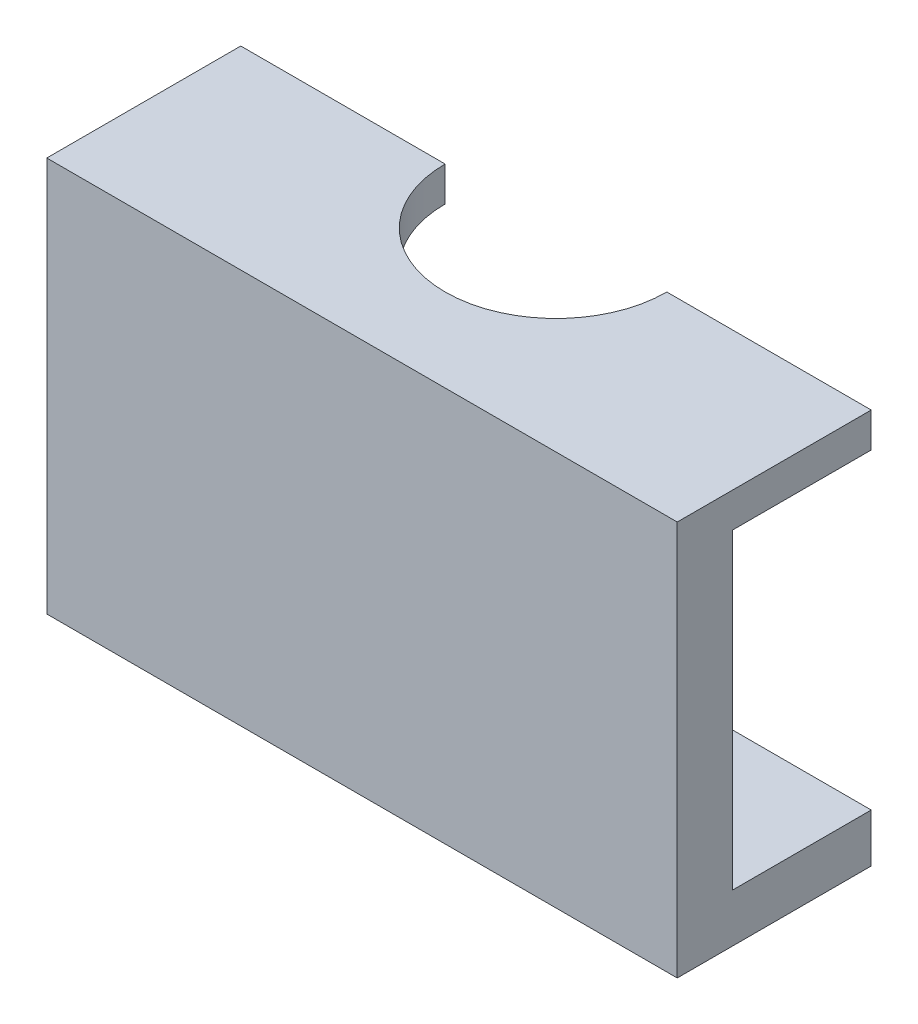
ISO-10303-21;
HEADER;
FILE_DESCRIPTION(('STEP AP214'),'2;1');
FILE_NAME('part.step','',(''),(''),'','','');
FILE_SCHEMA(('AUTOMOTIVE_DESIGN { 1 0 10303 214 1 1 1 1 }'));
ENDSEC;
DATA;
#1=APPLICATION_CONTEXT('core data for automotive mechanical design processes');
#2=APPLICATION_PROTOCOL_DEFINITION('international standard','automotive_design',2000,#1);
#3=PRODUCT_CONTEXT('',#1,'mechanical');
#4=PRODUCT('Part','Part','',(#3));
#5=PRODUCT_RELATED_PRODUCT_CATEGORY('part','',(#4));
#6=PRODUCT_DEFINITION_FORMATION('','',#4);
#7=PRODUCT_DEFINITION_CONTEXT('part definition',#1,'design');
#8=PRODUCT_DEFINITION('design','',#6,#7);
#9=PRODUCT_DEFINITION_SHAPE('','',#8);
#10=(LENGTH_UNIT() NAMED_UNIT(*) SI_UNIT(.MILLI.,.METRE.));
#11=(NAMED_UNIT(*) PLANE_ANGLE_UNIT() SI_UNIT($,.RADIAN.));
#12=(NAMED_UNIT(*) SI_UNIT($,.STERADIAN.) SOLID_ANGLE_UNIT());
#13=UNCERTAINTY_MEASURE_WITH_UNIT(LENGTH_MEASURE(1.E-05),#10,'distance_accuracy_value','');
#14=(GEOMETRIC_REPRESENTATION_CONTEXT(3) GLOBAL_UNCERTAINTY_ASSIGNED_CONTEXT((#13)) GLOBAL_UNIT_ASSIGNED_CONTEXT((#10,
#11,#12)) REPRESENTATION_CONTEXT('',''));
#15=CARTESIAN_POINT('',(0.,0.,0.));
#16=DIRECTION('',(0.,0.,1.));
#17=DIRECTION('',(1.,0.,0.));
#18=AXIS2_PLACEMENT_3D('',#15,#16,#17);
#19=CARTESIAN_POINT('',(0.,0.,0.));
#20=DIRECTION('',(0.,0.,-1.));
#21=DIRECTION('',(-1.,0.,0.));
#22=AXIS2_PLACEMENT_3D('',#19,#20,#21);
#23=PLANE('',#22);
#24=DIRECTION('',(1.,0.,0.));
#25=VECTOR('',#24,1.);
#26=CARTESIAN_POINT('',(0.,3.5,0.));
#27=LINE('',#26,#25);
#28=CARTESIAN_POINT('',(0.,3.5,0.));
#29=VERTEX_POINT('',#28);
#30=CARTESIAN_POINT('',(11.65,3.5,0.));
#31=VERTEX_POINT('',#30);
#32=EDGE_CURVE('E274',#29,#31,#27,.T.);
#33=ORIENTED_EDGE('',*,*,#32,.T.);
#34=DIRECTION('',(0.,-1.,0.));
#35=VECTOR('',#34,1.);
#36=CARTESIAN_POINT('',(11.65,59.8955410846827,0.));
#37=LINE('',#36,#35);
#38=CARTESIAN_POINT('',(11.65,0.,0.));
#39=VERTEX_POINT('',#38);
#40=EDGE_CURVE('E149',#39,#31,#37,.F.);
#41=ORIENTED_EDGE('',*,*,#40,.F.);
#42=DIRECTION('',(1.,0.,0.));
#43=VECTOR('',#42,1.);
#44=CARTESIAN_POINT('',(0.,0.,0.));
#45=LINE('',#44,#43);
#46=CARTESIAN_POINT('',(0.,0.,0.));
#47=VERTEX_POINT('',#46);
#48=EDGE_CURVE('E173',#47,#39,#45,.T.);
#49=ORIENTED_EDGE('',*,*,#48,.F.);
#50=DIRECTION('',(0.,-1.,0.));
#51=VECTOR('',#50,1.);
#52=CARTESIAN_POINT('',(0.,0.,0.));
#53=LINE('',#52,#51);
#54=EDGE_CURVE('E169',#29,#47,#53,.T.);
#55=ORIENTED_EDGE('',*,*,#54,.F.);
#56=EDGE_LOOP('',(#33,#41,#49,#55));
#57=FACE_BOUND('',#56,.T.);
#58=ADVANCED_FACE('F41',(#57),#23,.T.);
#59=CARTESIAN_POINT('',(33.85,3.5,0.));
#60=VERTEX_POINT('',#59);
#61=CARTESIAN_POINT('',(45.5,3.5,0.));
#62=VERTEX_POINT('',#61);
#63=EDGE_CURVE('E234',#60,#62,#27,.T.);
#64=ORIENTED_EDGE('',*,*,#63,.T.);
#65=DIRECTION('',(0.,1.,0.));
#66=VECTOR('',#65,1.);
#67=CARTESIAN_POINT('',(45.5,0.,0.));
#68=LINE('',#67,#66);
#69=CARTESIAN_POINT('',(45.5,0.,0.));
#70=VERTEX_POINT('',#69);
#71=EDGE_CURVE('E183',#70,#62,#68,.T.);
#72=ORIENTED_EDGE('',*,*,#71,.F.);
#73=CARTESIAN_POINT('',(33.85,0.,0.));
#74=VERTEX_POINT('',#73);
#75=EDGE_CURVE('E168',#74,#70,#45,.T.);
#76=ORIENTED_EDGE('',*,*,#75,.F.);
#77=DIRECTION('',(0.,-1.,0.));
#78=VECTOR('',#77,1.);
#79=CARTESIAN_POINT('',(33.85,59.8955410846827,0.));
#80=LINE('',#79,#78);
#81=EDGE_CURVE('E215',#60,#74,#80,.T.);
#82=ORIENTED_EDGE('',*,*,#81,.F.);
#83=EDGE_LOOP('',(#64,#72,#76,#82));
#84=FACE_BOUND('',#83,.T.);
#85=ADVANCED_FACE('F232',(#84),#23,.T.);
#86=CARTESIAN_POINT('',(22.75,-1.5,0.));
#87=DIRECTION('',(0.,1.,0.));
#88=DIRECTION('',(0.,0.,1.));
#89=AXIS2_PLACEMENT_3D('',#86,#87,#88);
#90=CYLINDRICAL_SURFACE('',#89,8.);
#91=CARTESIAN_POINT('',(22.75,26.,0.));
#92=DIRECTION('',(0.,-1.,0.));
#93=DIRECTION('',(0.,0.,-1.));
#94=AXIS2_PLACEMENT_3D('',#91,#92,#93);
#95=CIRCLE('',#94,8.);
#96=CARTESIAN_POINT('',(14.75,26.,0.));
#97=VERTEX_POINT('',#96);
#98=CARTESIAN_POINT('',(30.75,26.,0.));
#99=VERTEX_POINT('',#98);
#100=EDGE_CURVE('E213',#97,#99,#95,.F.);
#101=ORIENTED_EDGE('',*,*,#100,.F.);
#102=DIRECTION('',(0.,1.,0.));
#103=VECTOR('',#102,1.);
#104=CARTESIAN_POINT('',(14.75,-1.5,0.));
#105=LINE('',#104,#103);
#106=CARTESIAN_POINT('',(14.75,28.5,0.));
#107=VERTEX_POINT('',#106);
#108=EDGE_CURVE('E147',#97,#107,#105,.T.);
#109=ORIENTED_EDGE('',*,*,#108,.T.);
#110=CARTESIAN_POINT('',(22.75,28.5,0.));
#111=DIRECTION('',(0.,1.,0.));
#112=DIRECTION('',(0.,0.,1.));
#113=AXIS2_PLACEMENT_3D('',#110,#111,#112);
#114=CIRCLE('',#113,8.);
#115=CARTESIAN_POINT('',(30.75,28.5,0.));
#116=VERTEX_POINT('',#115);
#117=EDGE_CURVE('E175',#107,#116,#114,.T.);
#118=ORIENTED_EDGE('',*,*,#117,.T.);
#119=DIRECTION('',(0.,1.,0.));
#120=VECTOR('',#119,1.);
#121=CARTESIAN_POINT('',(30.75,-1.5,0.));
#122=LINE('',#121,#120);
#123=EDGE_CURVE('E207',#116,#99,#122,.F.);
#124=ORIENTED_EDGE('',*,*,#123,.T.);
#125=EDGE_LOOP('',(#101,#109,#118,#124));
#126=FACE_BOUND('',#125,.T.);
#127=ADVANCED_FACE('F323',(#126),#90,.F.);
#128=DIRECTION('',(-1.,0.,0.));
#129=VECTOR('',#128,1.);
#130=CARTESIAN_POINT('',(0.,26.,0.));
#131=LINE('',#130,#129);
#132=CARTESIAN_POINT('',(0.,26.,0.));
#133=VERTEX_POINT('',#132);
#134=EDGE_CURVE('E64',#97,#133,#131,.T.);
#135=ORIENTED_EDGE('',*,*,#134,.T.);
#136=CARTESIAN_POINT('',(0.,28.5,0.));
#137=VERTEX_POINT('',#136);
#138=EDGE_CURVE('E146',#137,#133,#53,.T.);
#139=ORIENTED_EDGE('',*,*,#138,.F.);
#140=DIRECTION('',(-1.,0.,0.));
#141=VECTOR('',#140,1.);
#142=CARTESIAN_POINT('',(0.,28.5,0.));
#143=LINE('',#142,#141);
#144=EDGE_CURVE('E187',#107,#137,#143,.T.);
#145=ORIENTED_EDGE('',*,*,#144,.F.);
#146=ORIENTED_EDGE('',*,*,#108,.F.);
#147=EDGE_LOOP('',(#135,#139,#145,#146));
#148=FACE_BOUND('',#147,.T.);
#149=ADVANCED_FACE('F143',(#148),#23,.T.);
#150=CARTESIAN_POINT('',(0.,0.,14.));
#151=DIRECTION('',(1.,0.,0.));
#152=DIRECTION('',(0.,0.,-1.));
#153=AXIS2_PLACEMENT_3D('',#150,#151,#152);
#154=PLANE('',#153);
#155=DIRECTION('',(0.,-1.,0.));
#156=VECTOR('',#155,1.);
#157=CARTESIAN_POINT('',(0.,26.,9.99725954309286));
#158=LINE('',#157,#156);
#159=CARTESIAN_POINT('',(0.,26.,9.99725954309286));
#160=VERTEX_POINT('',#159);
#161=CARTESIAN_POINT('',(0.,3.5,9.99725954309285));
#162=VERTEX_POINT('',#161);
#163=EDGE_CURVE('E160',#160,#162,#158,.T.);
#164=ORIENTED_EDGE('',*,*,#163,.T.);
#165=DIRECTION('',(0.,0.,-1.));
#166=VECTOR('',#165,1.);
#167=CARTESIAN_POINT('',(0.,3.5,0.));
#168=LINE('',#167,#166);
#169=EDGE_CURVE('E294',#162,#29,#168,.T.);
#170=ORIENTED_EDGE('',*,*,#169,.T.);
#171=ORIENTED_EDGE('',*,*,#54,.T.);
#172=DIRECTION('',(0.,0.,-1.));
#173=VECTOR('',#172,1.);
#174=CARTESIAN_POINT('',(0.,0.,14.));
#175=LINE('',#174,#173);
#176=CARTESIAN_POINT('',(0.,0.,14.));
#177=VERTEX_POINT('',#176);
#178=EDGE_CURVE('E203',#177,#47,#175,.T.);
#179=ORIENTED_EDGE('',*,*,#178,.F.);
#180=DIRECTION('',(0.,-1.,0.));
#181=VECTOR('',#180,1.);
#182=CARTESIAN_POINT('',(0.,0.,14.));
#183=LINE('',#182,#181);
#184=CARTESIAN_POINT('',(0.,28.5,14.));
#185=VERTEX_POINT('',#184);
#186=EDGE_CURVE('E192',#185,#177,#183,.T.);
#187=ORIENTED_EDGE('',*,*,#186,.F.);
#188=DIRECTION('',(0.,0.,-1.));
#189=VECTOR('',#188,1.);
#190=CARTESIAN_POINT('',(0.,28.5,14.));
#191=LINE('',#190,#189);
#192=EDGE_CURVE('E166',#185,#137,#191,.T.);
#193=ORIENTED_EDGE('',*,*,#192,.T.);
#194=ORIENTED_EDGE('',*,*,#138,.T.);
#195=DIRECTION('',(0.,0.,1.));
#196=VECTOR('',#195,1.);
#197=CARTESIAN_POINT('',(0.,26.,0.));
#198=LINE('',#197,#196);
#199=EDGE_CURVE('E153',#133,#160,#198,.T.);
#200=ORIENTED_EDGE('',*,*,#199,.T.);
#201=EDGE_LOOP('',(#164,#170,#171,#179,#187,#193,#194,#200));
#202=FACE_BOUND('',#201,.T.);
#203=ADVANCED_FACE('F43',(#202),#154,.F.);
#204=CARTESIAN_POINT('',(0.,0.,14.));
#205=DIRECTION('',(0.,1.,0.));
#206=DIRECTION('',(0.,0.,1.));
#207=AXIS2_PLACEMENT_3D('',#204,#205,#206);
#208=PLANE('',#207);
#209=ORIENTED_EDGE('',*,*,#48,.T.);
#210=CARTESIAN_POINT('',(22.75,0.,0.));
#211=DIRECTION('',(0.,-1.,0.));
#212=DIRECTION('',(0.,0.,-1.));
#213=AXIS2_PLACEMENT_3D('',#210,#211,#212);
#214=CIRCLE('',#213,11.1);
#215=EDGE_CURVE('E239',#74,#39,#214,.T.);
#216=ORIENTED_EDGE('',*,*,#215,.F.);
#217=ORIENTED_EDGE('',*,*,#75,.T.);
#218=DIRECTION('',(0.,0.,-1.));
#219=VECTOR('',#218,1.);
#220=CARTESIAN_POINT('',(45.5,0.,14.));
#221=LINE('',#220,#219);
#222=CARTESIAN_POINT('',(45.5,0.,14.));
#223=VERTEX_POINT('',#222);
#224=EDGE_CURVE('E199',#223,#70,#221,.T.);
#225=ORIENTED_EDGE('',*,*,#224,.F.);
#226=DIRECTION('',(1.,0.,0.));
#227=VECTOR('',#226,1.);
#228=CARTESIAN_POINT('',(0.,0.,14.));
#229=LINE('',#228,#227);
#230=EDGE_CURVE('E248',#177,#223,#229,.T.);
#231=ORIENTED_EDGE('',*,*,#230,.F.);
#232=ORIENTED_EDGE('',*,*,#178,.T.);
#233=EDGE_LOOP('',(#209,#216,#217,#225,#231,#232));
#234=FACE_BOUND('',#233,.T.);
#235=ADVANCED_FACE('F237',(#234),#208,.F.);
#236=CARTESIAN_POINT('',(45.5,0.,14.));
#237=DIRECTION('',(-1.,0.,0.));
#238=DIRECTION('',(0.,0.,1.));
#239=AXIS2_PLACEMENT_3D('',#236,#237,#238);
#240=PLANE('',#239);
#241=ORIENTED_EDGE('',*,*,#71,.T.);
#242=DIRECTION('',(0.,0.,-1.));
#243=VECTOR('',#242,1.);
#244=CARTESIAN_POINT('',(45.5,3.5,0.));
#245=LINE('',#244,#243);
#246=CARTESIAN_POINT('',(45.5,3.5,9.99725954309285));
#247=VERTEX_POINT('',#246);
#248=EDGE_CURVE('E161',#247,#62,#245,.T.);
#249=ORIENTED_EDGE('',*,*,#248,.F.);
#250=DIRECTION('',(0.,-1.,0.));
#251=VECTOR('',#250,1.);
#252=CARTESIAN_POINT('',(45.5,26.,9.99725954309286));
#253=LINE('',#252,#251);
#254=CARTESIAN_POINT('',(45.5,26.,9.99725954309286));
#255=VERTEX_POINT('',#254);
#256=EDGE_CURVE('E287',#255,#247,#253,.T.);
#257=ORIENTED_EDGE('',*,*,#256,.F.);
#258=DIRECTION('',(0.,0.,1.));
#259=VECTOR('',#258,1.);
#260=CARTESIAN_POINT('',(45.5,26.,0.));
#261=LINE('',#260,#259);
#262=CARTESIAN_POINT('',(45.5,26.,0.));
#263=VERTEX_POINT('',#262);
#264=EDGE_CURVE('E291',#263,#255,#261,.T.);
#265=ORIENTED_EDGE('',*,*,#264,.F.);
#266=CARTESIAN_POINT('',(45.5,28.5,0.));
#267=VERTEX_POINT('',#266);
#268=EDGE_CURVE('E182',#263,#267,#68,.T.);
#269=ORIENTED_EDGE('',*,*,#268,.T.);
#270=DIRECTION('',(0.,0.,-1.));
#271=VECTOR('',#270,1.);
#272=CARTESIAN_POINT('',(45.5,28.5,14.));
#273=LINE('',#272,#271);
#274=CARTESIAN_POINT('',(45.5,28.5,14.));
#275=VERTEX_POINT('',#274);
#276=EDGE_CURVE('E195',#275,#267,#273,.T.);
#277=ORIENTED_EDGE('',*,*,#276,.F.);
#278=DIRECTION('',(0.,1.,0.));
#279=VECTOR('',#278,1.);
#280=CARTESIAN_POINT('',(45.5,0.,14.));
#281=LINE('',#280,#279);
#282=EDGE_CURVE('E244',#223,#275,#281,.T.);
#283=ORIENTED_EDGE('',*,*,#282,.F.);
#284=ORIENTED_EDGE('',*,*,#224,.T.);
#285=EDGE_LOOP('',(#241,#249,#257,#265,#269,#277,#283,#284));
#286=FACE_BOUND('',#285,.T.);
#287=ADVANCED_FACE('F241',(#286),#240,.F.);
#288=CARTESIAN_POINT('',(0.,28.5,14.));
#289=DIRECTION('',(0.,-1.,0.));
#290=DIRECTION('',(0.,0.,-1.));
#291=AXIS2_PLACEMENT_3D('',#288,#289,#290);
#292=PLANE('',#291);
#293=EDGE_CURVE('E188',#267,#116,#143,.T.);
#294=ORIENTED_EDGE('',*,*,#293,.T.);
#295=ORIENTED_EDGE('',*,*,#117,.F.);
#296=ORIENTED_EDGE('',*,*,#144,.T.);
#297=ORIENTED_EDGE('',*,*,#192,.F.);
#298=DIRECTION('',(-1.,0.,0.));
#299=VECTOR('',#298,1.);
#300=CARTESIAN_POINT('',(0.,28.5,14.));
#301=LINE('',#300,#299);
#302=EDGE_CURVE('E177',#275,#185,#301,.T.);
#303=ORIENTED_EDGE('',*,*,#302,.F.);
#304=ORIENTED_EDGE('',*,*,#276,.T.);
#305=EDGE_LOOP('',(#294,#295,#296,#297,#303,#304));
#306=FACE_BOUND('',#305,.T.);
#307=ADVANCED_FACE('F311',(#306),#292,.F.);
#308=CARTESIAN_POINT('',(0.,0.,14.));
#309=DIRECTION('',(0.,0.,-1.));
#310=DIRECTION('',(-1.,0.,0.));
#311=AXIS2_PLACEMENT_3D('',#308,#309,#310);
#312=PLANE('',#311);
#313=ORIENTED_EDGE('',*,*,#186,.T.);
#314=ORIENTED_EDGE('',*,*,#230,.T.);
#315=ORIENTED_EDGE('',*,*,#282,.T.);
#316=ORIENTED_EDGE('',*,*,#302,.T.);
#317=EDGE_LOOP('',(#313,#314,#315,#316));
#318=FACE_BOUND('',#317,.T.);
#319=ADVANCED_FACE('F309',(#318),#312,.F.);
#320=ORIENTED_EDGE('',*,*,#268,.F.);
#321=DIRECTION('',(-1.,0.,0.));
#322=VECTOR('',#321,1.);
#323=CARTESIAN_POINT('',(0.,26.,0.));
#324=LINE('',#323,#322);
#325=EDGE_CURVE('E150',#263,#99,#324,.T.);
#326=ORIENTED_EDGE('',*,*,#325,.T.);
#327=ORIENTED_EDGE('',*,*,#123,.F.);
#328=ORIENTED_EDGE('',*,*,#293,.F.);
#329=EDGE_LOOP('',(#320,#326,#327,#328));
#330=FACE_BOUND('',#329,.T.);
#331=ADVANCED_FACE('F321',(#330),#23,.T.);
#332=CARTESIAN_POINT('',(22.75,59.8955410846827,0.));
#333=DIRECTION('',(0.,-1.,0.));
#334=DIRECTION('',(0.,0.,-1.));
#335=AXIS2_PLACEMENT_3D('',#332,#333,#334);
#336=CYLINDRICAL_SURFACE('',#335,11.1);
#337=ORIENTED_EDGE('',*,*,#40,.T.);
#338=CARTESIAN_POINT('',(22.75,3.5,0.));
#339=DIRECTION('',(0.,-1.,0.));
#340=DIRECTION('',(0.,0.,-1.));
#341=AXIS2_PLACEMENT_3D('',#338,#339,#340);
#342=CIRCLE('',#341,11.1);
#343=CARTESIAN_POINT('',(17.9266400063816,3.5,9.99725954309285));
#344=VERTEX_POINT('',#343);
#345=EDGE_CURVE('E12',#31,#344,#342,.F.);
#346=ORIENTED_EDGE('',*,*,#345,.T.);
#347=DIRECTION('',(0.,-1.,0.));
#348=VECTOR('',#347,1.);
#349=CARTESIAN_POINT('',(17.9266400063816,59.8955410846827,9.99725954309286));
#350=LINE('',#349,#348);
#351=CARTESIAN_POINT('',(17.9266400063816,26.,9.99725954309286));
#352=VERTEX_POINT('',#351);
#353=EDGE_CURVE('E268',#344,#352,#350,.F.);
#354=ORIENTED_EDGE('',*,*,#353,.T.);
#355=CARTESIAN_POINT('',(22.75,26.,0.));
#356=DIRECTION('',(0.,-1.,0.));
#357=DIRECTION('',(0.,0.,-1.));
#358=AXIS2_PLACEMENT_3D('',#355,#356,#357);
#359=CIRCLE('',#358,11.1);
#360=CARTESIAN_POINT('',(27.5733599936184,26.,9.99725954309286));
#361=VERTEX_POINT('',#360);
#362=EDGE_CURVE('E263',#352,#361,#359,.F.);
#363=ORIENTED_EDGE('',*,*,#362,.T.);
#364=DIRECTION('',(0.,-1.,0.));
#365=VECTOR('',#364,1.);
#366=CARTESIAN_POINT('',(27.5733599936184,59.8955410846827,9.99725954309286));
#367=LINE('',#366,#365);
#368=CARTESIAN_POINT('',(27.5733599936184,3.5,9.99725954309285));
#369=VERTEX_POINT('',#368);
#370=EDGE_CURVE('E226',#361,#369,#367,.T.);
#371=ORIENTED_EDGE('',*,*,#370,.T.);
#372=EDGE_CURVE('E45',#369,#60,#342,.F.);
#373=ORIENTED_EDGE('',*,*,#372,.T.);
#374=ORIENTED_EDGE('',*,*,#81,.T.);
#375=ORIENTED_EDGE('',*,*,#215,.T.);
#376=EDGE_LOOP('',(#337,#346,#354,#363,#371,#373,#374,#375));
#377=FACE_BOUND('',#376,.T.);
#378=ADVANCED_FACE('F224',(#377),#336,.F.);
#379=CARTESIAN_POINT('',(0.,26.,14.));
#380=DIRECTION('',(0.,-1.,0.));
#381=DIRECTION('',(0.,0.,-1.));
#382=AXIS2_PLACEMENT_3D('',#379,#380,#381);
#383=PLANE('',#382);
#384=ORIENTED_EDGE('',*,*,#362,.F.);
#385=DIRECTION('',(1.,0.,0.));
#386=VECTOR('',#385,1.);
#387=CARTESIAN_POINT('',(0.,26.,9.99725954309286));
#388=LINE('',#387,#386);
#389=EDGE_CURVE('E155',#160,#352,#388,.T.);
#390=ORIENTED_EDGE('',*,*,#389,.F.);
#391=ORIENTED_EDGE('',*,*,#199,.F.);
#392=ORIENTED_EDGE('',*,*,#134,.F.);
#393=ORIENTED_EDGE('',*,*,#100,.T.);
#394=ORIENTED_EDGE('',*,*,#325,.F.);
#395=ORIENTED_EDGE('',*,*,#264,.T.);
#396=EDGE_CURVE('E57',#361,#255,#388,.T.);
#397=ORIENTED_EDGE('',*,*,#396,.F.);
#398=EDGE_LOOP('',(#384,#390,#391,#392,#393,#394,#395,#397));
#399=FACE_BOUND('',#398,.T.);
#400=ADVANCED_FACE('F154',(#399),#383,.T.);
#401=CARTESIAN_POINT('',(0.,26.,9.99725954309286));
#402=DIRECTION('',(0.,0.,1.));
#403=DIRECTION('',(0.,-1.,0.));
#404=AXIS2_PLACEMENT_3D('',#401,#402,#403);
#405=PLANE('',#404);
#406=ORIENTED_EDGE('',*,*,#396,.T.);
#407=ORIENTED_EDGE('',*,*,#256,.T.);
#408=DIRECTION('',(1.,0.,0.));
#409=VECTOR('',#408,1.);
#410=CARTESIAN_POINT('',(0.,3.5,9.99725954309285));
#411=LINE('',#410,#409);
#412=EDGE_CURVE('E277',#369,#247,#411,.T.);
#413=ORIENTED_EDGE('',*,*,#412,.F.);
#414=ORIENTED_EDGE('',*,*,#370,.F.);
#415=EDGE_LOOP('',(#406,#407,#413,#414));
#416=FACE_BOUND('',#415,.T.);
#417=ADVANCED_FACE('F325',(#416),#405,.F.);
#418=CARTESIAN_POINT('',(0.,3.5,0.));
#419=DIRECTION('',(0.,-1.,0.));
#420=DIRECTION('',(0.,0.,-1.));
#421=AXIS2_PLACEMENT_3D('',#418,#419,#420);
#422=PLANE('',#421);
#423=ORIENTED_EDGE('',*,*,#412,.T.);
#424=ORIENTED_EDGE('',*,*,#248,.T.);
#425=ORIENTED_EDGE('',*,*,#63,.F.);
#426=ORIENTED_EDGE('',*,*,#372,.F.);
#427=EDGE_LOOP('',(#423,#424,#425,#426));
#428=FACE_BOUND('',#427,.T.);
#429=ADVANCED_FACE('F329',(#428),#422,.F.);
#430=ORIENTED_EDGE('',*,*,#32,.F.);
#431=ORIENTED_EDGE('',*,*,#169,.F.);
#432=EDGE_CURVE('E278',#162,#344,#411,.T.);
#433=ORIENTED_EDGE('',*,*,#432,.T.);
#434=ORIENTED_EDGE('',*,*,#345,.F.);
#435=EDGE_LOOP('',(#430,#431,#433,#434));
#436=FACE_BOUND('',#435,.T.);
#437=ADVANCED_FACE('F304',(#436),#422,.F.);
#438=ORIENTED_EDGE('',*,*,#432,.F.);
#439=ORIENTED_EDGE('',*,*,#163,.F.);
#440=ORIENTED_EDGE('',*,*,#389,.T.);
#441=ORIENTED_EDGE('',*,*,#353,.F.);
#442=EDGE_LOOP('',(#438,#439,#440,#441));
#443=FACE_BOUND('',#442,.T.);
#444=ADVANCED_FACE('F302',(#443),#405,.F.);
#445=CLOSED_SHELL('',(#58,#85,#127,#149,#203,#235,#287,#307,#319,#331,#378,#400,#417,#429,#437,#444));
#446=MANIFOLD_SOLID_BREP('B2',#445);
#447=ADVANCED_BREP_SHAPE_REPRESENTATION('',(#18,#446),#14);
#448=SHAPE_DEFINITION_REPRESENTATION(#9,#447);
ENDSEC;
END-ISO-10303-21;
